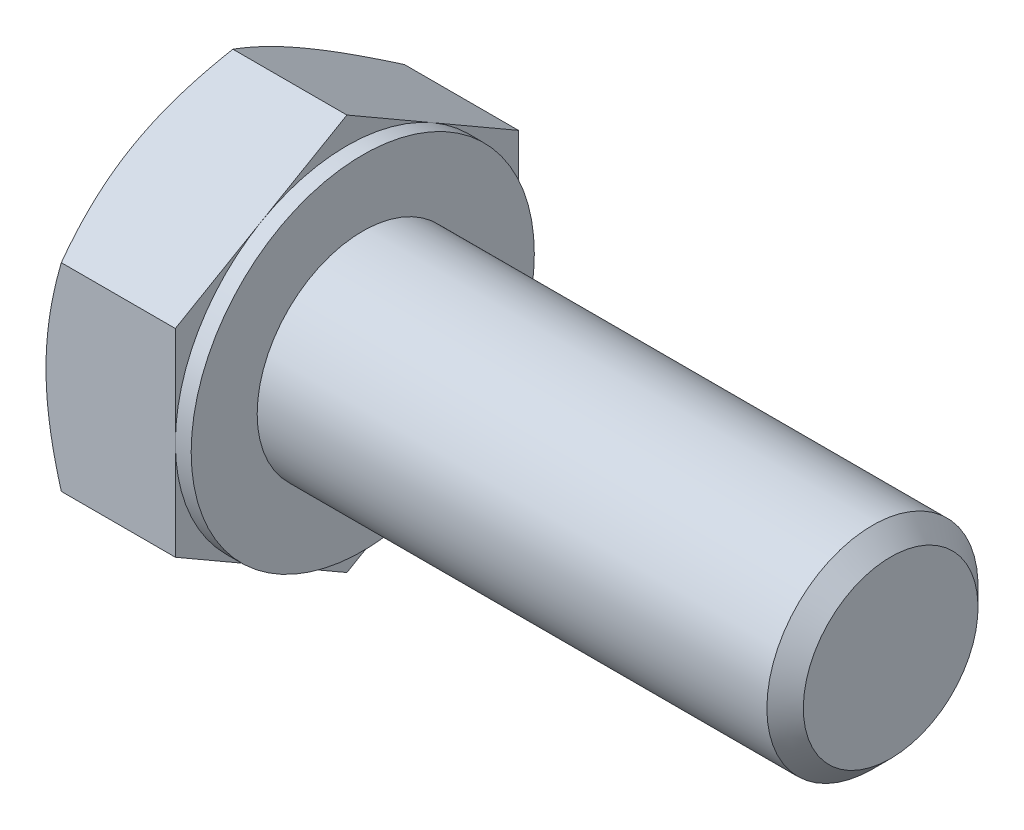
ISO-10303-21;
HEADER;
FILE_DESCRIPTION(('STEP AP214'),'2;1');
FILE_NAME('part.step','',(''),(''),'','','');
FILE_SCHEMA(('AUTOMOTIVE_DESIGN { 1 0 10303 214 1 1 1 1 }'));
ENDSEC;
DATA;
#1=APPLICATION_CONTEXT('core data for automotive mechanical design processes');
#2=APPLICATION_PROTOCOL_DEFINITION('international standard','automotive_design',2000,#1);
#3=PRODUCT_CONTEXT('',#1,'mechanical');
#4=PRODUCT('Part','Part','',(#3));
#5=PRODUCT_RELATED_PRODUCT_CATEGORY('part','',(#4));
#6=PRODUCT_DEFINITION_FORMATION('','',#4);
#7=PRODUCT_DEFINITION_CONTEXT('part definition',#1,'design');
#8=PRODUCT_DEFINITION('design','',#6,#7);
#9=PRODUCT_DEFINITION_SHAPE('','',#8);
#10=(LENGTH_UNIT() NAMED_UNIT(*) SI_UNIT(.MILLI.,.METRE.));
#11=(NAMED_UNIT(*) PLANE_ANGLE_UNIT() SI_UNIT($,.RADIAN.));
#12=(NAMED_UNIT(*) SI_UNIT($,.STERADIAN.) SOLID_ANGLE_UNIT());
#13=UNCERTAINTY_MEASURE_WITH_UNIT(LENGTH_MEASURE(1.E-05),#10,'distance_accuracy_value','');
#14=(GEOMETRIC_REPRESENTATION_CONTEXT(3) GLOBAL_UNCERTAINTY_ASSIGNED_CONTEXT((#13)) GLOBAL_UNIT_ASSIGNED_CONTEXT((#10,
#11,#12)) REPRESENTATION_CONTEXT('',''));
#15=CARTESIAN_POINT('',(0.,0.,0.));
#16=DIRECTION('',(0.,0.,1.));
#17=DIRECTION('',(1.,0.,0.));
#18=AXIS2_PLACEMENT_3D('',#15,#16,#17);
#19=CARTESIAN_POINT('',(0.,7.50555349946514,0.));
#20=DIRECTION('',(1.,0.,0.));
#21=DIRECTION('',(0.,0.,-1.));
#22=AXIS2_PLACEMENT_3D('',#19,#20,#21);
#23=PLANE('',#22);
#24=CARTESIAN_POINT('',(0.,0.,0.));
#25=DIRECTION('',(1.,0.,0.));
#26=DIRECTION('',(0.,0.,-1.));
#27=AXIS2_PLACEMENT_3D('',#24,#25,#26);
#28=CIRCLE('',#27,6.49999999995998);
#29=CARTESIAN_POINT('',(1.15546531814981E-11,-5.62916512458152,-3.24999999999));
#30=VERTEX_POINT('',#29);
#31=CARTESIAN_POINT('',(1.15518155498369E-11,0.,-6.49999999997999));
#32=VERTEX_POINT('',#31);
#33=EDGE_CURVE('E85',#30,#32,#28,.T.);
#34=ORIENTED_EDGE('',*,*,#33,.F.);
#35=CARTESIAN_POINT('',(0.,0.,0.));
#36=DIRECTION('',(1.,0.,0.));
#37=DIRECTION('',(0.,0.,-1.));
#38=AXIS2_PLACEMENT_3D('',#35,#36,#37);
#39=CIRCLE('',#38,6.49999999995998);
#40=CARTESIAN_POINT('',(1.15535774221326E-11,-5.62916512458152,3.24999999999001));
#41=VERTEX_POINT('',#40);
#42=EDGE_CURVE('E20',#41,#30,#39,.T.);
#43=ORIENTED_EDGE('',*,*,#42,.F.);
#44=CARTESIAN_POINT('',(0.,0.,0.));
#45=DIRECTION('',(1.,0.,0.));
#46=DIRECTION('',(0.,0.,-1.));
#47=AXIS2_PLACEMENT_3D('',#44,#45,#46);
#48=CIRCLE('',#47,6.49999999995998);
#49=CARTESIAN_POINT('',(1.15519510751084E-11,0.,6.49999999997999));
#50=VERTEX_POINT('',#49);
#51=EDGE_CURVE('E425',#50,#41,#48,.T.);
#52=ORIENTED_EDGE('',*,*,#51,.F.);
#53=CARTESIAN_POINT('',(0.,0.,0.));
#54=DIRECTION('',(1.,0.,0.));
#55=DIRECTION('',(0.,0.,-1.));
#56=AXIS2_PLACEMENT_3D('',#53,#54,#55);
#57=CIRCLE('',#56,6.49999999995998);
#58=CARTESIAN_POINT('',(1.1552080213042E-11,5.62916512458152,3.24999999999));
#59=VERTEX_POINT('',#58);
#60=EDGE_CURVE('E143',#59,#50,#57,.T.);
#61=ORIENTED_EDGE('',*,*,#60,.F.);
#62=CARTESIAN_POINT('',(0.,0.,0.));
#63=DIRECTION('',(1.,0.,0.));
#64=DIRECTION('',(0.,0.,-1.));
#65=AXIS2_PLACEMENT_3D('',#62,#63,#64);
#66=CIRCLE('',#65,6.49999999995998);
#67=CARTESIAN_POINT('',(1.15517781399171E-11,5.62916512458152,-3.24999999999));
#68=VERTEX_POINT('',#67);
#69=EDGE_CURVE('E426',#68,#59,#66,.T.);
#70=ORIENTED_EDGE('',*,*,#69,.F.);
#71=CARTESIAN_POINT('',(0.,0.,0.));
#72=DIRECTION('',(1.,0.,0.));
#73=DIRECTION('',(0.,0.,-1.));
#74=AXIS2_PLACEMENT_3D('',#71,#72,#73);
#75=CIRCLE('',#74,6.49999999995998);
#76=EDGE_CURVE('E88',#32,#68,#75,.T.);
#77=ORIENTED_EDGE('',*,*,#76,.F.);
#78=EDGE_LOOP('',(#34,#43,#52,#61,#70,#77));
#79=FACE_BOUND('',#78,.T.);
#80=ADVANCED_FACE('F17',(#79),#23,.F.);
#81=CARTESIAN_POINT('',(0.584039923069213,0.,0.));
#82=DIRECTION('',(1.,0.,0.));
#83=DIRECTION('',(0.,0.,-1.));
#84=AXIS2_PLACEMENT_3D('',#81,#82,#83);
#85=CONICAL_SURFACE('',#84,7.51158682032838,1.04719755118114);
#86=ORIENTED_EDGE('',*,*,#42,.T.);
#87=CARTESIAN_POINT('',(2.38325579768452E-11,-5.62916512459777,-3.24999999999938));
#88=CARTESIAN_POINT('',(-2.65652344197939E-05,-5.70880728473444,-3.11205573221975));
#89=CARTESIAN_POINT('',(0.0033797276327546,-5.78844560823781,-2.97411810968296));
#90=CARTESIAN_POINT('',(0.016860583058583,-5.94756588426545,-2.69851370708918));
#91=CARTESIAN_POINT('',(0.0269338255103951,-6.0270478646226,-2.56084687882423));
#92=CARTESIAN_POINT('',(0.0534848017047234,-6.18534206384329,-2.28667328323044));
#93=CARTESIAN_POINT('',(0.0699302938058354,-6.26415564509039,-2.15016415618406));
#94=CARTESIAN_POINT('',(0.108872020471756,-6.42140731241903,-1.87779627879596));
#95=CARTESIAN_POINT('',(0.131368414300897,-6.49984538856168,-1.74193754566893));
#96=CARTESIAN_POINT('',(0.207238975570002,-6.73427122699104,-1.33590008290232));
#97=CARTESIAN_POINT('',(0.269031363404723,-6.88957797343333,-1.06690090730607));
#98=CARTESIAN_POINT('',(0.41154041463193,-7.19885589649827,-0.531215830898221));
#99=CARTESIAN_POINT('',(0.492351589124999,-7.35281628522807,-0.264548615265171));
#100=CARTESIAN_POINT('',(0.580556583641226,-7.50555349945931,-1.01125705032068E-11));
#101=B_SPLINE_CURVE_WITH_KNOTS('',3,(#87,#88,#89,#90,#91,#92,#93,#94,#95,#96,#97,#98,#99,#100),
.UNSPECIFIED.,.F.,.F.,(4,2,2,2,2,2,4),(0.,0.4778041950496,0.95551380951934,1.43083727329502,
1.90617324917007,2.85559935539958,3.80984701130552),.UNSPECIFIED.);
#102=CARTESIAN_POINT('',(0.580556583641226,-7.50555349945931,0.));
#103=VERTEX_POINT('',#102);
#104=EDGE_CURVE('E100',#30,#103,#101,.T.);
#105=ORIENTED_EDGE('',*,*,#104,.T.);
#106=CARTESIAN_POINT('',(0.580556583641226,-7.50555349945931,1.01147123436235E-11));
#107=CARTESIAN_POINT('',(0.492351589125005,-7.35281628522806,0.264548615265161));
#108=CARTESIAN_POINT('',(0.411540414631936,-7.19885589649828,0.531215830898202));
#109=CARTESIAN_POINT('',(0.269031363404727,-6.88957797343335,1.06690090730604));
#110=CARTESIAN_POINT('',(0.207238975570004,-6.73427122699106,1.33590008290229));
#111=CARTESIAN_POINT('',(0.131368414300904,-6.49984538856169,1.74193754566889));
#112=CARTESIAN_POINT('',(0.108872020471767,-6.42140731241905,1.87779627879591));
#113=CARTESIAN_POINT('',(0.0699302938058367,-6.26415564509043,2.150164156184));
#114=CARTESIAN_POINT('',(0.0534848017047109,-6.18534206384335,2.28667328323039));
#115=CARTESIAN_POINT('',(0.0269338255104189,-6.02704786462262,2.56084687882413));
#116=CARTESIAN_POINT('',(0.0168605830586569,-5.9475658842654,2.69851370708902));
#117=CARTESIAN_POINT('',(0.00337972763268682,-5.78844560823798,2.9741181096829));
#118=CARTESIAN_POINT('',(-2.65652346796055E-05,-5.7088072847349,3.11205573221983));
#119=CARTESIAN_POINT('',(2.31066127431789E-11,-5.62916512459895,3.24999999999984));
#120=B_SPLINE_CURVE_WITH_KNOTS('',3,(#106,#107,#108,#109,#110,#111,#112,#113,#114,#115,#116,
#117,#118,#119),.UNSPECIFIED.,.F.,.F.,(4,2,2,2,2,2,4),(0.,0.954247655905908,1.90367376213542,
2.37900973801043,2.85433320178609,3.33204281625579,3.80984701130534),.UNSPECIFIED.);
#121=EDGE_CURVE('E106',#103,#41,#120,.T.);
#122=ORIENTED_EDGE('',*,*,#121,.T.);
#123=EDGE_LOOP('',(#86,#105,#122));
#124=FACE_BOUND('',#123,.T.);
#125=ADVANCED_FACE('F104',(#124),#85,.T.);
#126=CARTESIAN_POINT('',(0.584039923069213,0.,0.));
#127=DIRECTION('',(1.,0.,0.));
#128=DIRECTION('',(0.,0.,-1.));
#129=AXIS2_PLACEMENT_3D('',#126,#127,#128);
#130=CONICAL_SURFACE('',#129,7.51158682032838,1.04719755118114);
#131=ORIENTED_EDGE('',*,*,#33,.T.);
#132=CARTESIAN_POINT('',(2.38257762244022E-11,0.,-6.49999999999875));
#133=CARTESIAN_POINT('',(-2.65652344264496E-05,-0.159284320271938,-6.49999999999955));
#134=CARTESIAN_POINT('',(0.00337972763274824,-0.318560967278108,-6.49999999999988));
#135=CARTESIAN_POINT('',(0.0168605830585772,-0.636801519332982,-6.50000000000012));
#136=CARTESIAN_POINT('',(0.0269338255103896,-0.79576548004743,-6.50000000000003));
#137=CARTESIAN_POINT('',(0.053484801704718,-1.11235387848891,-6.49999999999997));
#138=CARTESIAN_POINT('',(0.0699302938058299,-1.26998104098307,-6.49999999999999));
#139=CARTESIAN_POINT('',(0.10887202047175,-1.58448437564033,-6.50000000000001));
#140=CARTESIAN_POINT('',(0.131368414300891,-1.74136052792563,-6.5));
#141=CARTESIAN_POINT('',(0.207238975569996,-2.21021220478437,-6.49999999999999));
#142=CARTESIAN_POINT('',(0.269031363404717,-2.52082569766895,-6.5));
#143=CARTESIAN_POINT('',(0.411540414631923,-3.13938154379882,-6.5));
#144=CARTESIAN_POINT('',(0.492351589124993,-3.4473023212584,-6.50000000000001));
#145=CARTESIAN_POINT('',(0.58055658364122,-3.7527767497209,-6.5));
#146=B_SPLINE_CURVE_WITH_KNOTS('',3,(#132,#133,#134,#135,#136,#137,#138,#139,#140,#141,#142,
#143,#144,#145),.UNSPECIFIED.,.F.,.F.,(4,2,2,2,2,2,4),(0.,0.477804195049599,0.955513809519338,
1.43083727329502,1.90617324917006,2.85559935539958,3.80984701130552),.UNSPECIFIED.);
#147=CARTESIAN_POINT('',(0.58055658364122,-3.75277674972966,-6.49999999999494));
#148=VERTEX_POINT('',#147);
#149=EDGE_CURVE('E95',#32,#148,#146,.T.);
#150=ORIENTED_EDGE('',*,*,#149,.T.);
#151=CARTESIAN_POINT('',(0.58055658364122,-3.75277674973842,-6.49999999998988));
#152=CARTESIAN_POINT('',(0.492351589125,-3.90551396396966,-6.23545138473484));
#153=CARTESIAN_POINT('',(0.411540414631933,-4.05947435269944,-5.9687841691018));
#154=CARTESIAN_POINT('',(0.269031363404726,-4.36875227576437,-5.43309909269397));
#155=CARTESIAN_POINT('',(0.207238975570003,-4.52405902220665,-5.16409991709772));
#156=CARTESIAN_POINT('',(0.131368414300906,-4.75848486063602,-4.75806245433112));
#157=CARTESIAN_POINT('',(0.108872020471769,-4.83692293677866,-4.62220372120411));
#158=CARTESIAN_POINT('',(0.0699302938058388,-4.99417460410728,-4.34983584381602));
#159=CARTESIAN_POINT('',(0.053484801704713,-5.07298818535436,-4.21332671676963));
#160=CARTESIAN_POINT('',(0.0269338255104213,-5.23128238457509,-3.93915312117589));
#161=CARTESIAN_POINT('',(0.0168605830586596,-5.31076436493231,-3.801486292911));
#162=CARTESIAN_POINT('',(0.00337972763269,-5.46988464095972,-3.52588189031713));
#163=CARTESIAN_POINT('',(-2.65652346763305E-05,-5.5495229644628,-3.3879442677802));
#164=CARTESIAN_POINT('',(2.31095567487627E-11,-5.62916512459875,-3.25000000000019));
#165=B_SPLINE_CURVE_WITH_KNOTS('',3,(#151,#152,#153,#154,#155,#156,#157,#158,#159,#160,#161,
#162,#163,#164),.UNSPECIFIED.,.F.,.F.,(4,2,2,2,2,2,4),(0.,0.9542476559059,1.9036737621354,
2.37900973801041,2.85433320178607,3.33204281625576,3.8098470113053),.UNSPECIFIED.);
#166=EDGE_CURVE('E93',#148,#30,#165,.T.);
#167=ORIENTED_EDGE('',*,*,#166,.T.);
#168=EDGE_LOOP('',(#131,#150,#167));
#169=FACE_BOUND('',#168,.T.);
#170=ADVANCED_FACE('F94',(#169),#130,.T.);
#171=CARTESIAN_POINT('',(0.584039923069213,0.,0.));
#172=DIRECTION('',(1.,0.,0.));
#173=DIRECTION('',(0.,0.,-1.));
#174=AXIS2_PLACEMENT_3D('',#171,#172,#173);
#175=CONICAL_SURFACE('',#174,7.51158682032838,1.04719755118114);
#176=CARTESIAN_POINT('',(0.580556583641216,3.75277674972088,-6.5));
#177=CARTESIAN_POINT('',(0.492351589124997,3.4473023212584,-6.5));
#178=CARTESIAN_POINT('',(0.411540414631929,3.13938154379883,-6.5));
#179=CARTESIAN_POINT('',(0.26903136340472,2.52082569766897,-6.5));
#180=CARTESIAN_POINT('',(0.207238975569997,2.21021220478441,-6.5));
#181=CARTESIAN_POINT('',(0.131368414300899,1.74136052792568,-6.5));
#182=CARTESIAN_POINT('',(0.108872020471763,1.58448437564038,-6.5));
#183=CARTESIAN_POINT('',(0.0699302938058331,1.26998104098315,-6.5));
#184=CARTESIAN_POINT('',(0.053484801704707,1.112353878489,-6.5));
#185=CARTESIAN_POINT('',(0.0269338255104151,0.795765480047534,-6.5));
#186=CARTESIAN_POINT('',(0.0168605830586536,0.636801519333099,-6.5));
#187=CARTESIAN_POINT('',(0.00337972763268423,0.318560967278262,-6.5));
#188=CARTESIAN_POINT('',(-2.65652346820322E-05,0.159284320272115,-6.5));
#189=CARTESIAN_POINT('',(2.31036310996737E-11,2.06995547822371E-13,-6.5));
#190=B_SPLINE_CURVE_WITH_KNOTS('',3,(#176,#177,#178,#179,#180,#181,#182,#183,#184,#185,#186,
#187,#188,#189),.UNSPECIFIED.,.F.,.F.,(4,2,2,2,2,2,4),(0.,0.954247655905902,1.9036737621354,
2.37900973801042,2.85433320178607,3.33204281625577,3.80984701130531),.UNSPECIFIED.);
#191=CARTESIAN_POINT('',(0.580556583641216,3.75277674972964,-6.49999999999494));
#192=VERTEX_POINT('',#191);
#193=EDGE_CURVE('E114',#192,#32,#190,.T.);
#194=ORIENTED_EDGE('',*,*,#193,.T.);
#195=ORIENTED_EDGE('',*,*,#76,.T.);
#196=CARTESIAN_POINT('',(2.38253841741424E-11,5.62916512459776,-3.24999999999938));
#197=CARTESIAN_POINT('',(-2.65652344257806E-05,5.54952296446249,-3.38794426777982));
#198=CARTESIAN_POINT('',(0.00337972763274904,5.46988464095969,-3.52588189031693));
#199=CARTESIAN_POINT('',(0.0168605830585776,5.31076436493246,-3.80148629291095));
#200=CARTESIAN_POINT('',(0.0269338255103895,5.23128238457516,-3.93915312117581));
#201=CARTESIAN_POINT('',(0.0534848017047175,5.07298818535436,-4.21332671676953));
#202=CARTESIAN_POINT('',(0.0699302938058295,4.9941746041073,-4.34983584381594));
#203=CARTESIAN_POINT('',(0.108872020471749,4.83692293677869,-4.62220372120405));
#204=CARTESIAN_POINT('',(0.13136841430089,4.75848486063604,-4.75806245433108));
#205=CARTESIAN_POINT('',(0.207238975569994,4.52405902220666,-5.16409991709768));
#206=CARTESIAN_POINT('',(0.269031363404715,4.36875227576437,-5.43309909269393));
#207=CARTESIAN_POINT('',(0.411540414631921,4.05947435269944,-5.96878416910178));
#208=CARTESIAN_POINT('',(0.492351589124989,3.90551396396965,-6.23545138473483));
#209=CARTESIAN_POINT('',(0.580556583641216,3.7527767497384,-6.49999999998989));
#210=B_SPLINE_CURVE_WITH_KNOTS('',3,(#196,#197,#198,#199,#200,#201,#202,#203,#204,#205,#206,
#207,#208,#209),.UNSPECIFIED.,.F.,.F.,(4,2,2,2,2,2,4),(0.,0.477804195049598,0.955513809519334,
1.43083727329501,1.90617324917006,2.85559935539956,3.8098470113055),.UNSPECIFIED.);
#211=EDGE_CURVE('E219',#68,#192,#210,.T.);
#212=ORIENTED_EDGE('',*,*,#211,.T.);
#213=EDGE_LOOP('',(#194,#195,#212));
#214=FACE_BOUND('',#213,.T.);
#215=ADVANCED_FACE('F209',(#214),#175,.T.);
#216=CARTESIAN_POINT('',(0.584039923069213,0.,0.));
#217=DIRECTION('',(1.,0.,0.));
#218=DIRECTION('',(0.,0.,-1.));
#219=AXIS2_PLACEMENT_3D('',#216,#217,#218);
#220=CONICAL_SURFACE('',#219,7.51158682032838,1.04719755118114);
#221=CARTESIAN_POINT('',(0.580556583641221,7.5055534994593,-1.01144862034732E-11));
#222=CARTESIAN_POINT('',(0.492351589125001,7.35281628522806,-0.26454861526516));
#223=CARTESIAN_POINT('',(0.411540414631932,7.19885589649827,-0.531215830898201));
#224=CARTESIAN_POINT('',(0.269031363404723,6.88957797343334,-1.06690090730603));
#225=CARTESIAN_POINT('',(0.20723897557,6.73427122699106,-1.33590008290229));
#226=CARTESIAN_POINT('',(0.131368414300901,6.49984538856169,-1.74193754566888));
#227=CARTESIAN_POINT('',(0.108872020471764,6.42140731241904,-1.8777962787959));
#228=CARTESIAN_POINT('',(0.0699302938058345,6.26415564509043,-2.15016415618399));
#229=CARTESIAN_POINT('',(0.0534848017047085,6.18534206384335,-2.28667328323038));
#230=CARTESIAN_POINT('',(0.0269338255104163,6.02704786462262,-2.56084687882412));
#231=CARTESIAN_POINT('',(0.0168605830586543,5.9475658842654,-2.69851370708901));
#232=CARTESIAN_POINT('',(0.00337972763268413,5.78844560823798,-2.97411810968289));
#233=CARTESIAN_POINT('',(-2.65652346823943E-05,5.70880728473491,-3.11205573221982));
#234=CARTESIAN_POINT('',(2.31035562798342E-11,5.62916512459895,-3.24999999999983));
#235=B_SPLINE_CURVE_WITH_KNOTS('',3,(#221,#222,#223,#224,#225,#226,#227,#228,#229,#230,#231,
#232,#233,#234),.UNSPECIFIED.,.F.,.F.,(4,2,2,2,2,2,4),(0.,0.954247655905905,1.90367376213541,
2.37900973801043,2.85433320178608,3.33204281625578,3.80984701130532),.UNSPECIFIED.);
#236=CARTESIAN_POINT('',(0.580556583641221,7.5055534994593,0.));
#237=VERTEX_POINT('',#236);
#238=EDGE_CURVE('E214',#237,#68,#235,.T.);
#239=ORIENTED_EDGE('',*,*,#238,.T.);
#240=ORIENTED_EDGE('',*,*,#69,.T.);
#241=CARTESIAN_POINT('',(2.38257500923756E-11,5.62916512459776,3.24999999999938));
#242=CARTESIAN_POINT('',(-2.65652344257552E-05,5.70880728473443,3.11205573221975));
#243=CARTESIAN_POINT('',(0.00337972763274897,5.7884456082378,2.97411810968296));
#244=CARTESIAN_POINT('',(0.0168605830585776,5.94756588426544,2.69851370708918));
#245=CARTESIAN_POINT('',(0.0269338255103896,6.02704786462259,2.56084687882423));
#246=CARTESIAN_POINT('',(0.0534848017047181,6.18534206384328,2.28667328323044));
#247=CARTESIAN_POINT('',(0.0699302938058302,6.26415564509038,2.15016415618406));
#248=CARTESIAN_POINT('',(0.10887202047175,6.42140731241902,1.87779627879596));
#249=CARTESIAN_POINT('',(0.131368414300891,6.49984538856167,1.74193754566893));
#250=CARTESIAN_POINT('',(0.207238975569995,6.73427122699103,1.33590008290232));
#251=CARTESIAN_POINT('',(0.269031363404717,6.88957797343332,1.06690090730607));
#252=CARTESIAN_POINT('',(0.411540414631924,7.19885589649826,0.531215830898222));
#253=CARTESIAN_POINT('',(0.492351589124994,7.35281628522806,0.264548615265173));
#254=CARTESIAN_POINT('',(0.580556583641221,7.5055534994593,1.01137987216797E-11));
#255=B_SPLINE_CURVE_WITH_KNOTS('',3,(#241,#242,#243,#244,#245,#246,#247,#248,#249,#250,#251,
#252,#253,#254),.UNSPECIFIED.,.F.,.F.,(4,2,2,2,2,2,4),(0.,0.4778041950496,0.955513809519338,
1.43083727329502,1.90617324917006,2.85559935539958,3.80984701130552),.UNSPECIFIED.);
#256=EDGE_CURVE('E201',#59,#237,#255,.T.);
#257=ORIENTED_EDGE('',*,*,#256,.T.);
#258=EDGE_LOOP('',(#239,#240,#257));
#259=FACE_BOUND('',#258,.T.);
#260=ADVANCED_FACE('F206',(#259),#220,.T.);
#261=CARTESIAN_POINT('',(0.584039923069213,0.,0.));
#262=DIRECTION('',(1.,0.,0.));
#263=DIRECTION('',(0.,0.,-1.));
#264=AXIS2_PLACEMENT_3D('',#261,#262,#263);
#265=CONICAL_SURFACE('',#264,7.51158682032838,1.04719755118114);
#266=ORIENTED_EDGE('',*,*,#51,.T.);
#267=CARTESIAN_POINT('',(2.38300876645125E-11,-5.62916512459776,3.24999999999939));
#268=CARTESIAN_POINT('',(-2.65652344226972E-05,-5.54952296446249,3.38794426777983));
#269=CARTESIAN_POINT('',(0.00337972763275166,-5.46988464095969,3.52588189031694));
#270=CARTESIAN_POINT('',(0.0168605830585802,-5.31076436493246,3.80148629291096));
#271=CARTESIAN_POINT('',(0.0269338255103924,-5.23128238457516,3.93915312117582));
#272=CARTESIAN_POINT('',(0.0534848017047206,-5.07298818535436,4.21332671676954));
#273=CARTESIAN_POINT('',(0.0699302938058323,-4.9941746041073,4.34983584381595));
#274=CARTESIAN_POINT('',(0.108872020471752,-4.83692293677869,4.62220372120406));
#275=CARTESIAN_POINT('',(0.131368414300893,-4.75848486063604,4.75806245433109));
#276=CARTESIAN_POINT('',(0.207238975569996,-4.52405902220666,5.16409991709768));
#277=CARTESIAN_POINT('',(0.269031363404717,-4.36875227576437,5.43309909269394));
#278=CARTESIAN_POINT('',(0.411540414631922,-4.05947435269944,5.96878416910179));
#279=CARTESIAN_POINT('',(0.492351589124991,-3.90551396396965,6.23545138473484));
#280=CARTESIAN_POINT('',(0.580556583641217,-3.7527767497384,6.49999999998989));
#281=B_SPLINE_CURVE_WITH_KNOTS('',3,(#267,#268,#269,#270,#271,#272,#273,#274,#275,#276,#277,
#278,#279,#280),.UNSPECIFIED.,.F.,.F.,(4,2,2,2,2,2,4),(0.,0.477804195049597,0.955513809519332,
1.43083727329501,1.90617324917005,2.85559935539956,3.80984701130549),.UNSPECIFIED.);
#282=CARTESIAN_POINT('',(0.580556583642902,-3.75277674973548,6.49999999999494));
#283=VERTEX_POINT('',#282);
#284=EDGE_CURVE('E101',#41,#283,#281,.T.);
#285=ORIENTED_EDGE('',*,*,#284,.T.);
#286=CARTESIAN_POINT('',(0.580556583641216,-3.75277674972088,6.5));
#287=CARTESIAN_POINT('',(0.492351589124997,-3.4473023212584,6.5));
#288=CARTESIAN_POINT('',(0.411540414631929,-3.13938154379883,6.5));
#289=CARTESIAN_POINT('',(0.269031363404721,-2.52082569766897,6.5));
#290=CARTESIAN_POINT('',(0.207238975569998,-2.21021220478441,6.5));
#291=CARTESIAN_POINT('',(0.1313684143009,-1.74136052792568,6.5));
#292=CARTESIAN_POINT('',(0.108872020471763,-1.58448437564038,6.5));
#293=CARTESIAN_POINT('',(0.0699302938058334,-1.26998104098315,6.5));
#294=CARTESIAN_POINT('',(0.0534848017047079,-1.112353878489,6.5));
#295=CARTESIAN_POINT('',(0.026933825510416,-0.795765480047534,6.5));
#296=CARTESIAN_POINT('',(0.0168605830586538,-0.636801519333099,6.5));
#297=CARTESIAN_POINT('',(0.00337972763268369,-0.318560967278262,6.5));
#298=CARTESIAN_POINT('',(-2.65652346827006E-05,-0.159284320272115,6.5));
#299=CARTESIAN_POINT('',(2.31039021502168E-11,-2.0623652689199E-13,6.5));
#300=B_SPLINE_CURVE_WITH_KNOTS('',3,(#286,#287,#288,#289,#290,#291,#292,#293,#294,#295,#296,
#297,#298,#299),.UNSPECIFIED.,.F.,.F.,(4,2,2,2,2,2,4),(0.,0.954247655905902,1.9036737621354,
2.37900973801042,2.85433320178607,3.33204281625577,3.80984701130531),.UNSPECIFIED.);
#301=EDGE_CURVE('E180',#283,#50,#300,.T.);
#302=ORIENTED_EDGE('',*,*,#301,.T.);
#303=EDGE_LOOP('',(#266,#285,#302));
#304=FACE_BOUND('',#303,.T.);
#305=ADVANCED_FACE('F158',(#304),#265,.T.);
#306=CARTESIAN_POINT('',(0.584039923069213,0.,0.));
#307=DIRECTION('',(1.,0.,0.));
#308=DIRECTION('',(0.,0.,-1.));
#309=AXIS2_PLACEMENT_3D('',#306,#307,#308);
#310=CONICAL_SURFACE('',#309,7.51158682032838,1.04719755118114);
#311=CARTESIAN_POINT('',(0.580556583641216,3.7527767497384,6.49999999998989));
#312=CARTESIAN_POINT('',(0.492351589124997,3.90551396396964,6.23545138473484));
#313=CARTESIAN_POINT('',(0.411540414631929,4.05947435269943,5.9687841691018));
#314=CARTESIAN_POINT('',(0.269031363404721,4.36875227576436,5.43309909269397));
#315=CARTESIAN_POINT('',(0.207238975569998,4.52405902220664,5.16409991709772));
#316=CARTESIAN_POINT('',(0.1313684143009,4.75848486063601,4.75806245433112));
#317=CARTESIAN_POINT('',(0.108872020471763,4.83692293677865,4.6222037212041));
#318=CARTESIAN_POINT('',(0.0699302938058336,4.99417460410727,4.34983584381602));
#319=CARTESIAN_POINT('',(0.053484801704708,5.07298818535435,4.21332671676963));
#320=CARTESIAN_POINT('',(0.0269338255104162,5.23128238457508,3.93915312117589));
#321=CARTESIAN_POINT('',(0.0168605830586542,5.3107643649323,3.801486292911));
#322=CARTESIAN_POINT('',(0.0033797276326841,5.46988464095971,3.52588189031713));
#323=CARTESIAN_POINT('',(-2.65652346823871E-05,5.54952296446279,3.3879442677802));
#324=CARTESIAN_POINT('',(2.3103743517881E-11,5.62916512459874,3.25000000000019));
#325=B_SPLINE_CURVE_WITH_KNOTS('',3,(#311,#312,#313,#314,#315,#316,#317,#318,#319,#320,#321,
#322,#323,#324),.UNSPECIFIED.,.F.,.F.,(4,2,2,2,2,2,4),(0.,0.9542476559059,1.9036737621354,
2.37900973801042,2.85433320178607,3.33204281625577,3.80984701130531),.UNSPECIFIED.);
#326=CARTESIAN_POINT('',(0.580556583641216,3.75277674972964,6.49999999999494));
#327=VERTEX_POINT('',#326);
#328=EDGE_CURVE('E164',#327,#59,#325,.T.);
#329=ORIENTED_EDGE('',*,*,#328,.T.);
#330=ORIENTED_EDGE('',*,*,#60,.T.);
#331=CARTESIAN_POINT('',(2.38257917229847E-11,0.,6.49999999999875));
#332=CARTESIAN_POINT('',(-2.65652344260361E-05,0.159284320271937,6.49999999999955));
#333=CARTESIAN_POINT('',(0.00337972763274861,0.318560967278107,6.49999999999988));
#334=CARTESIAN_POINT('',(0.0168605830585772,0.63680151933298,6.50000000000012));
#335=CARTESIAN_POINT('',(0.0269338255103893,0.795765480047427,6.50000000000003));
#336=CARTESIAN_POINT('',(0.0534848017047176,1.11235387848891,6.49999999999997));
#337=CARTESIAN_POINT('',(0.0699302938058295,1.26998104098307,6.49999999999999));
#338=CARTESIAN_POINT('',(0.108872020471749,1.58448437564032,6.50000000000001));
#339=CARTESIAN_POINT('',(0.13136841430089,1.74136052792562,6.5));
#340=CARTESIAN_POINT('',(0.207238975569994,2.21021220478437,6.49999999999999));
#341=CARTESIAN_POINT('',(0.269031363404715,2.52082569766894,6.5));
#342=CARTESIAN_POINT('',(0.411540414631921,3.13938154379881,6.5));
#343=CARTESIAN_POINT('',(0.492351589124989,3.44730232125839,6.50000000000001));
#344=CARTESIAN_POINT('',(0.580556583641216,3.75277674972088,6.5));
#345=B_SPLINE_CURVE_WITH_KNOTS('',3,(#331,#332,#333,#334,#335,#336,#337,#338,#339,#340,#341,
#342,#343,#344),.UNSPECIFIED.,.F.,.F.,(4,2,2,2,2,2,4),(0.,0.477804195049598,0.955513809519334,
1.43083727329501,1.90617324917006,2.85559935539956,3.8098470113055),.UNSPECIFIED.);
#346=EDGE_CURVE('E172',#50,#327,#345,.T.);
#347=ORIENTED_EDGE('',*,*,#346,.T.);
#348=EDGE_LOOP('',(#329,#330,#347));
#349=FACE_BOUND('',#348,.T.);
#350=ADVANCED_FACE('F153',(#349),#310,.T.);
#351=CARTESIAN_POINT('',(5.5,-7.50555349946515,0.));
#352=DIRECTION('',(0.,0.866025403784438,-0.500000000000002));
#353=DIRECTION('',(0.,0.500000000000002,0.866025403784438));
#354=AXIS2_PLACEMENT_3D('',#351,#352,#353);
#355=PLANE('',#354);
#356=DIRECTION('',(1.,0.,0.));
#357=VECTOR('',#356,1.);
#358=CARTESIAN_POINT('',(5.5,-3.75277674973256,6.5));
#359=LINE('',#358,#357);
#360=CARTESIAN_POINT('',(4.9,-3.75277674973256,6.5));
#361=VERTEX_POINT('',#360);
#362=EDGE_CURVE('E339',#361,#283,#359,.F.);
#363=ORIENTED_EDGE('',*,*,#362,.T.);
#364=ORIENTED_EDGE('',*,*,#284,.F.);
#365=ORIENTED_EDGE('',*,*,#121,.F.);
#366=DIRECTION('',(1.,0.,0.));
#367=VECTOR('',#366,1.);
#368=CARTESIAN_POINT('',(5.5,-7.50555349946515,0.));
#369=LINE('',#368,#367);
#370=CARTESIAN_POINT('',(4.9,-7.50555349946515,0.));
#371=VERTEX_POINT('',#370);
#372=EDGE_CURVE('E112',#103,#371,#369,.T.);
#373=ORIENTED_EDGE('',*,*,#372,.T.);
#374=DIRECTION('',(0.,-0.500000000000003,-0.866025403784437));
#375=VECTOR('',#374,1.);
#376=CARTESIAN_POINT('',(4.9,-5.62916512459884,3.25000000000001));
#377=LINE('',#376,#375);
#378=CARTESIAN_POINT('',(4.9,-5.62916512459885,3.25000000000001));
#379=VERTEX_POINT('',#378);
#380=EDGE_CURVE('E293',#379,#371,#377,.T.);
#381=ORIENTED_EDGE('',*,*,#380,.F.);
#382=DIRECTION('',(0.,-0.500000000000001,-0.866025403784438));
#383=VECTOR('',#382,1.);
#384=CARTESIAN_POINT('',(4.9,-3.75277674973256,6.5));
#385=LINE('',#384,#383);
#386=EDGE_CURVE('E351',#361,#379,#385,.T.);
#387=ORIENTED_EDGE('',*,*,#386,.F.);
#388=EDGE_LOOP('',(#363,#364,#365,#373,#381,#387));
#389=FACE_BOUND('',#388,.T.);
#390=ADVANCED_FACE('F149',(#389),#355,.F.);
#391=CARTESIAN_POINT('',(5.5,-3.75277674973258,-6.5));
#392=DIRECTION('',(0.,0.866025403784438,0.500000000000001));
#393=DIRECTION('',(0.,-0.500000000000001,0.866025403784438));
#394=AXIS2_PLACEMENT_3D('',#391,#392,#393);
#395=PLANE('',#394);
#396=ORIENTED_EDGE('',*,*,#372,.F.);
#397=ORIENTED_EDGE('',*,*,#104,.F.);
#398=ORIENTED_EDGE('',*,*,#166,.F.);
#399=DIRECTION('',(1.,0.,0.));
#400=VECTOR('',#399,1.);
#401=CARTESIAN_POINT('',(5.5,-3.75277674973258,-6.5));
#402=LINE('',#401,#400);
#403=CARTESIAN_POINT('',(4.9,-3.75277674973258,-6.5));
#404=VERTEX_POINT('',#403);
#405=EDGE_CURVE('E220',#148,#404,#402,.T.);
#406=ORIENTED_EDGE('',*,*,#405,.T.);
#407=DIRECTION('',(0.,0.499999999999998,-0.86602540378444));
#408=VECTOR('',#407,1.);
#409=CARTESIAN_POINT('',(4.9,-5.62916512459885,-3.25));
#410=LINE('',#409,#408);
#411=CARTESIAN_POINT('',(4.9,-5.62916512459885,-3.25));
#412=VERTEX_POINT('',#411);
#413=EDGE_CURVE('E296',#412,#404,#410,.T.);
#414=ORIENTED_EDGE('',*,*,#413,.F.);
#415=DIRECTION('',(0.,0.500000000000003,-0.866025403784437));
#416=VECTOR('',#415,1.);
#417=CARTESIAN_POINT('',(4.9,-7.50555349946515,0.));
#418=LINE('',#417,#416);
#419=EDGE_CURVE('E287',#371,#412,#418,.T.);
#420=ORIENTED_EDGE('',*,*,#419,.F.);
#421=EDGE_LOOP('',(#396,#397,#398,#406,#414,#420));
#422=FACE_BOUND('',#421,.T.);
#423=ADVANCED_FACE('F109',(#422),#395,.F.);
#424=CARTESIAN_POINT('',(5.5,3.75277674973256,-6.5));
#425=DIRECTION('',(0.,0.,1.));
#426=DIRECTION('',(1.,0.,0.));
#427=AXIS2_PLACEMENT_3D('',#424,#425,#426);
#428=PLANE('',#427);
#429=ORIENTED_EDGE('',*,*,#405,.F.);
#430=ORIENTED_EDGE('',*,*,#149,.F.);
#431=ORIENTED_EDGE('',*,*,#193,.F.);
#432=DIRECTION('',(1.,0.,0.));
#433=VECTOR('',#432,1.);
#434=CARTESIAN_POINT('',(5.5,3.75277674973256,-6.5));
#435=LINE('',#434,#433);
#436=CARTESIAN_POINT('',(4.9,3.75277674973256,-6.5));
#437=VERTEX_POINT('',#436);
#438=EDGE_CURVE('E332',#192,#437,#435,.T.);
#439=ORIENTED_EDGE('',*,*,#438,.T.);
#440=DIRECTION('',(0.,1.,0.));
#441=VECTOR('',#440,1.);
#442=CARTESIAN_POINT('',(4.9,6.5,-6.5));
#443=LINE('',#442,#441);
#444=CARTESIAN_POINT('',(4.9,0.,-6.5));
#445=VERTEX_POINT('',#444);
#446=EDGE_CURVE('E372',#445,#437,#443,.T.);
#447=ORIENTED_EDGE('',*,*,#446,.F.);
#448=DIRECTION('',(0.,1.,0.));
#449=VECTOR('',#448,1.);
#450=CARTESIAN_POINT('',(4.9,6.5,-6.5));
#451=LINE('',#450,#449);
#452=EDGE_CURVE('E304',#404,#445,#451,.T.);
#453=ORIENTED_EDGE('',*,*,#452,.F.);
#454=EDGE_LOOP('',(#429,#430,#431,#439,#447,#453));
#455=FACE_BOUND('',#454,.T.);
#456=ADVANCED_FACE('F227',(#455),#428,.F.);
#457=CARTESIAN_POINT('',(5.5,3.75277674973256,-6.5));
#458=DIRECTION('',(0.,-0.866025403784438,0.500000000000001));
#459=DIRECTION('',(0.,-0.500000000000001,-0.866025403784438));
#460=AXIS2_PLACEMENT_3D('',#457,#458,#459);
#461=PLANE('',#460);
#462=ORIENTED_EDGE('',*,*,#438,.F.);
#463=ORIENTED_EDGE('',*,*,#211,.F.);
#464=ORIENTED_EDGE('',*,*,#238,.F.);
#465=DIRECTION('',(1.,0.,0.));
#466=VECTOR('',#465,1.);
#467=CARTESIAN_POINT('',(5.5,7.50555349946514,0.));
#468=LINE('',#467,#466);
#469=CARTESIAN_POINT('',(4.9,7.50555349946514,0.));
#470=VERTEX_POINT('',#469);
#471=EDGE_CURVE('E205',#237,#470,#468,.T.);
#472=ORIENTED_EDGE('',*,*,#471,.T.);
#473=DIRECTION('',(0.,0.500000000000001,0.866025403784438));
#474=VECTOR('',#473,1.);
#475=CARTESIAN_POINT('',(4.9,5.62916512459885,-3.25000000000001));
#476=LINE('',#475,#474);
#477=CARTESIAN_POINT('',(4.9,5.62916512459885,-3.25000000000001));
#478=VERTEX_POINT('',#477);
#479=EDGE_CURVE('E377',#478,#470,#476,.T.);
#480=ORIENTED_EDGE('',*,*,#479,.F.);
#481=DIRECTION('',(0.,0.500000000000002,0.866025403784438));
#482=VECTOR('',#481,1.);
#483=CARTESIAN_POINT('',(4.9,3.75277674973256,-6.5));
#484=LINE('',#483,#482);
#485=EDGE_CURVE('E367',#437,#478,#484,.T.);
#486=ORIENTED_EDGE('',*,*,#485,.F.);
#487=EDGE_LOOP('',(#462,#463,#464,#472,#480,#486));
#488=FACE_BOUND('',#487,.T.);
#489=ADVANCED_FACE('F197',(#488),#461,.F.);
#490=CARTESIAN_POINT('',(5.5,7.50555349946514,0.));
#491=DIRECTION('',(0.,-0.866025403784438,-0.500000000000001));
#492=DIRECTION('',(0.,0.500000000000001,-0.866025403784438));
#493=AXIS2_PLACEMENT_3D('',#490,#491,#492);
#494=PLANE('',#493);
#495=ORIENTED_EDGE('',*,*,#471,.F.);
#496=ORIENTED_EDGE('',*,*,#256,.F.);
#497=ORIENTED_EDGE('',*,*,#328,.F.);
#498=DIRECTION('',(1.,0.,0.));
#499=VECTOR('',#498,1.);
#500=CARTESIAN_POINT('',(5.5,3.75277674973256,6.5));
#501=LINE('',#500,#499);
#502=CARTESIAN_POINT('',(4.9,3.75277674973256,6.5));
#503=VERTEX_POINT('',#502);
#504=EDGE_CURVE('E179',#327,#503,#501,.T.);
#505=ORIENTED_EDGE('',*,*,#504,.T.);
#506=DIRECTION('',(0.,-0.500000000000001,0.866025403784438));
#507=VECTOR('',#506,1.);
#508=CARTESIAN_POINT('',(4.9,5.62916512459885,3.25000000000001));
#509=LINE('',#508,#507);
#510=CARTESIAN_POINT('',(4.9,5.62916512459885,3.25000000000001));
#511=VERTEX_POINT('',#510);
#512=EDGE_CURVE('E387',#511,#503,#509,.T.);
#513=ORIENTED_EDGE('',*,*,#512,.F.);
#514=DIRECTION('',(0.,-0.500000000000001,0.866025403784438));
#515=VECTOR('',#514,1.);
#516=CARTESIAN_POINT('',(4.9,7.50555349946514,0.));
#517=LINE('',#516,#515);
#518=EDGE_CURVE('E382',#470,#511,#517,.T.);
#519=ORIENTED_EDGE('',*,*,#518,.F.);
#520=EDGE_LOOP('',(#495,#496,#497,#505,#513,#519));
#521=FACE_BOUND('',#520,.T.);
#522=ADVANCED_FACE('F191',(#521),#494,.F.);
#523=CARTESIAN_POINT('',(5.5,3.75277674973256,6.5));
#524=DIRECTION('',(0.,0.,-1.));
#525=DIRECTION('',(0.,1.,0.));
#526=AXIS2_PLACEMENT_3D('',#523,#524,#525);
#527=PLANE('',#526);
#528=ORIENTED_EDGE('',*,*,#504,.F.);
#529=ORIENTED_EDGE('',*,*,#346,.F.);
#530=ORIENTED_EDGE('',*,*,#301,.F.);
#531=ORIENTED_EDGE('',*,*,#362,.F.);
#532=DIRECTION('',(0.,1.,0.));
#533=VECTOR('',#532,1.);
#534=CARTESIAN_POINT('',(4.9,6.5,6.5));
#535=LINE('',#534,#533);
#536=CARTESIAN_POINT('',(4.9,0.,6.5));
#537=VERTEX_POINT('',#536);
#538=EDGE_CURVE('E35',#537,#361,#535,.F.);
#539=ORIENTED_EDGE('',*,*,#538,.F.);
#540=DIRECTION('',(0.,1.,0.));
#541=VECTOR('',#540,1.);
#542=CARTESIAN_POINT('',(4.9,6.5,6.5));
#543=LINE('',#542,#541);
#544=EDGE_CURVE('E311',#503,#537,#543,.F.);
#545=ORIENTED_EDGE('',*,*,#544,.F.);
#546=EDGE_LOOP('',(#528,#529,#530,#531,#539,#545));
#547=FACE_BOUND('',#546,.T.);
#548=ADVANCED_FACE('F186',(#547),#527,.F.);
#549=CARTESIAN_POINT('',(4.9,6.5,0.));
#550=DIRECTION('',(1.,0.,0.));
#551=DIRECTION('',(0.,0.,-1.));
#552=AXIS2_PLACEMENT_3D('',#549,#550,#551);
#553=PLANE('',#552);
#554=ORIENTED_EDGE('',*,*,#386,.T.);
#555=CARTESIAN_POINT('',(4.9,0.,0.));
#556=DIRECTION('',(-1.,0.,0.));
#557=DIRECTION('',(0.,0.,1.));
#558=AXIS2_PLACEMENT_3D('',#555,#556,#557);
#559=CIRCLE('',#558,6.5);
#560=EDGE_CURVE('E181',#537,#379,#559,.F.);
#561=ORIENTED_EDGE('',*,*,#560,.F.);
#562=ORIENTED_EDGE('',*,*,#538,.T.);
#563=EDGE_LOOP('',(#554,#561,#562));
#564=FACE_BOUND('',#563,.T.);
#565=ADVANCED_FACE('F190',(#564),#553,.T.);
#566=CARTESIAN_POINT('',(4.9,6.5,0.));
#567=DIRECTION('',(1.,0.,0.));
#568=DIRECTION('',(0.,0.,-1.));
#569=AXIS2_PLACEMENT_3D('',#566,#567,#568);
#570=PLANE('',#569);
#571=ORIENTED_EDGE('',*,*,#419,.T.);
#572=CARTESIAN_POINT('',(4.9,0.,0.));
#573=DIRECTION('',(-1.,0.,0.));
#574=DIRECTION('',(0.,0.,1.));
#575=AXIS2_PLACEMENT_3D('',#572,#573,#574);
#576=CIRCLE('',#575,6.5);
#577=EDGE_CURVE('E290',#379,#412,#576,.F.);
#578=ORIENTED_EDGE('',*,*,#577,.F.);
#579=ORIENTED_EDGE('',*,*,#380,.T.);
#580=EDGE_LOOP('',(#571,#578,#579));
#581=FACE_BOUND('',#580,.T.);
#582=ADVANCED_FACE('F276',(#581),#570,.T.);
#583=CARTESIAN_POINT('',(4.9,6.5,0.));
#584=DIRECTION('',(1.,0.,0.));
#585=DIRECTION('',(0.,0.,-1.));
#586=AXIS2_PLACEMENT_3D('',#583,#584,#585);
#587=PLANE('',#586);
#588=ORIENTED_EDGE('',*,*,#452,.T.);
#589=CARTESIAN_POINT('',(4.9,0.,0.));
#590=DIRECTION('',(-1.,0.,0.));
#591=DIRECTION('',(0.,0.,1.));
#592=AXIS2_PLACEMENT_3D('',#589,#590,#591);
#593=CIRCLE('',#592,6.5);
#594=EDGE_CURVE('E301',#412,#445,#593,.F.);
#595=ORIENTED_EDGE('',*,*,#594,.F.);
#596=ORIENTED_EDGE('',*,*,#413,.T.);
#597=EDGE_LOOP('',(#588,#595,#596));
#598=FACE_BOUND('',#597,.T.);
#599=ADVANCED_FACE('F273',(#598),#587,.T.);
#600=CARTESIAN_POINT('',(4.9,6.5,0.));
#601=DIRECTION('',(1.,0.,0.));
#602=DIRECTION('',(0.,0.,-1.));
#603=AXIS2_PLACEMENT_3D('',#600,#601,#602);
#604=PLANE('',#603);
#605=CARTESIAN_POINT('',(4.9,0.,0.));
#606=DIRECTION('',(-1.,0.,0.));
#607=DIRECTION('',(0.,0.,1.));
#608=AXIS2_PLACEMENT_3D('',#605,#606,#607);
#609=CIRCLE('',#608,6.5);
#610=EDGE_CURVE('E307',#445,#478,#609,.F.);
#611=ORIENTED_EDGE('',*,*,#610,.F.);
#612=ORIENTED_EDGE('',*,*,#446,.T.);
#613=ORIENTED_EDGE('',*,*,#485,.T.);
#614=EDGE_LOOP('',(#611,#612,#613));
#615=FACE_BOUND('',#614,.T.);
#616=ADVANCED_FACE('F269',(#615),#604,.T.);
#617=CARTESIAN_POINT('',(4.9,6.5,0.));
#618=DIRECTION('',(1.,0.,0.));
#619=DIRECTION('',(0.,0.,-1.));
#620=AXIS2_PLACEMENT_3D('',#617,#618,#619);
#621=PLANE('',#620);
#622=ORIENTED_EDGE('',*,*,#518,.T.);
#623=CARTESIAN_POINT('',(4.9,0.,0.));
#624=DIRECTION('',(-1.,0.,0.));
#625=DIRECTION('',(0.,0.,1.));
#626=AXIS2_PLACEMENT_3D('',#623,#624,#625);
#627=CIRCLE('',#626,6.5);
#628=EDGE_CURVE('E314',#478,#511,#627,.F.);
#629=ORIENTED_EDGE('',*,*,#628,.F.);
#630=ORIENTED_EDGE('',*,*,#479,.T.);
#631=EDGE_LOOP('',(#622,#629,#630));
#632=FACE_BOUND('',#631,.T.);
#633=ADVANCED_FACE('F265',(#632),#621,.T.);
#634=CARTESIAN_POINT('',(4.9,6.5,0.));
#635=DIRECTION('',(1.,0.,0.));
#636=DIRECTION('',(0.,0.,-1.));
#637=AXIS2_PLACEMENT_3D('',#634,#635,#636);
#638=PLANE('',#637);
#639=ORIENTED_EDGE('',*,*,#544,.T.);
#640=CARTESIAN_POINT('',(4.9,0.,0.));
#641=DIRECTION('',(-1.,0.,0.));
#642=DIRECTION('',(0.,0.,1.));
#643=AXIS2_PLACEMENT_3D('',#640,#641,#642);
#644=CIRCLE('',#643,6.5);
#645=EDGE_CURVE('E317',#511,#537,#644,.F.);
#646=ORIENTED_EDGE('',*,*,#645,.F.);
#647=ORIENTED_EDGE('',*,*,#512,.T.);
#648=EDGE_LOOP('',(#639,#646,#647));
#649=FACE_BOUND('',#648,.T.);
#650=ADVANCED_FACE('F261',(#649),#638,.T.);
#651=CARTESIAN_POINT('',(25.5,0.,0.));
#652=DIRECTION('',(-1.,0.,0.));
#653=DIRECTION('',(0.,0.,1.));
#654=AXIS2_PLACEMENT_3D('',#651,#652,#653);
#655=PLANE('',#654);
#656=CARTESIAN_POINT('',(25.5000000000223,0.,0.));
#657=DIRECTION('',(-1.,0.,0.));
#658=DIRECTION('',(0.,-1.,0.));
#659=AXIS2_PLACEMENT_3D('',#656,#657,#658);
#660=CIRCLE('',#659,3.30949999994345);
#661=CARTESIAN_POINT('',(25.5000000000223,-3.30949999994345,0.));
#662=VERTEX_POINT('',#661);
#663=EDGE_CURVE('E319',#662,#662,#660,.T.);
#664=ORIENTED_EDGE('',*,*,#663,.F.);
#665=EDGE_LOOP('',(#664));
#666=FACE_BOUND('',#665,.T.);
#667=ADVANCED_FACE('F257',(#666),#655,.F.);
#668=CARTESIAN_POINT('',(0.,0.,0.));
#669=DIRECTION('',(-1.,0.,0.));
#670=DIRECTION('',(0.,0.,1.));
#671=AXIS2_PLACEMENT_3D('',#668,#669,#670);
#672=CYLINDRICAL_SURFACE('',#671,6.5);
#673=ORIENTED_EDGE('',*,*,#594,.T.);
#674=ORIENTED_EDGE('',*,*,#610,.T.);
#675=ORIENTED_EDGE('',*,*,#628,.T.);
#676=ORIENTED_EDGE('',*,*,#645,.T.);
#677=ORIENTED_EDGE('',*,*,#560,.T.);
#678=ORIENTED_EDGE('',*,*,#577,.T.);
#679=EDGE_LOOP('',(#673,#674,#675,#676,#677,#678));
#680=FACE_BOUND('',#679,.T.);
#681=CARTESIAN_POINT('',(5.5,0.,0.));
#682=DIRECTION('',(-1.,0.,0.));
#683=DIRECTION('',(0.,0.,1.));
#684=AXIS2_PLACEMENT_3D('',#681,#682,#683);
#685=CIRCLE('',#684,6.5);
#686=CARTESIAN_POINT('',(5.5,0.,6.5));
#687=VERTEX_POINT('',#686);
#688=EDGE_CURVE('E322',#687,#687,#685,.F.);
#689=ORIENTED_EDGE('',*,*,#688,.F.);
#690=EDGE_LOOP('',(#689));
#691=FACE_BOUND('',#690,.T.);
#692=ADVANCED_FACE('F253',(#680,#691),#672,.T.);
#693=CARTESIAN_POINT('',(24.8095000000035,0.,0.));
#694=DIRECTION('',(-1.,0.,0.));
#695=DIRECTION('',(0.,-1.,0.));
#696=AXIS2_PLACEMENT_3D('',#693,#694,#695);
#697=CONICAL_SURFACE('',#696,3.99999999996226,0.785398163397448);
#698=CARTESIAN_POINT('',(24.8095,0.,0.));
#699=DIRECTION('',(-1.,0.,0.));
#700=DIRECTION('',(0.,0.,1.));
#701=AXIS2_PLACEMENT_3D('',#698,#699,#700);
#702=CIRCLE('',#701,4.);
#703=CARTESIAN_POINT('',(24.8095,0.,4.));
#704=VERTEX_POINT('',#703);
#705=EDGE_CURVE('E26',#704,#704,#702,.T.);
#706=ORIENTED_EDGE('',*,*,#705,.F.);
#707=EDGE_LOOP('',(#706));
#708=FACE_BOUND('',#707,.T.);
#709=ORIENTED_EDGE('',*,*,#663,.T.);
#710=EDGE_LOOP('',(#709));
#711=FACE_BOUND('',#710,.T.);
#712=ADVANCED_FACE('F246',(#708,#711),#697,.T.);
#713=CARTESIAN_POINT('',(5.5,7.50555349946514,0.));
#714=DIRECTION('',(1.,0.,0.));
#715=DIRECTION('',(0.,0.,-1.));
#716=AXIS2_PLACEMENT_3D('',#713,#714,#715);
#717=PLANE('',#716);
#718=ORIENTED_EDGE('',*,*,#688,.T.);
#719=EDGE_LOOP('',(#718));
#720=FACE_BOUND('',#719,.T.);
#721=CARTESIAN_POINT('',(5.5,0.,0.));
#722=DIRECTION('',(-1.,0.,0.));
#723=DIRECTION('',(0.,0.,1.));
#724=AXIS2_PLACEMENT_3D('',#721,#722,#723);
#725=CIRCLE('',#724,4.);
#726=CARTESIAN_POINT('',(5.5,0.,4.));
#727=VERTEX_POINT('',#726);
#728=EDGE_CURVE('E11',#727,#727,#725,.F.);
#729=ORIENTED_EDGE('',*,*,#728,.F.);
#730=EDGE_LOOP('',(#729));
#731=FACE_BOUND('',#730,.T.);
#732=ADVANCED_FACE('F240',(#720,#731),#717,.T.);
#733=CARTESIAN_POINT('',(0.,0.,0.));
#734=DIRECTION('',(-1.,0.,0.));
#735=DIRECTION('',(0.,0.,1.));
#736=AXIS2_PLACEMENT_3D('',#733,#734,#735);
#737=CYLINDRICAL_SURFACE('',#736,4.);
#738=ORIENTED_EDGE('',*,*,#728,.T.);
#739=EDGE_LOOP('',(#738));
#740=FACE_BOUND('',#739,.T.);
#741=ORIENTED_EDGE('',*,*,#705,.T.);
#742=EDGE_LOOP('',(#741));
#743=FACE_BOUND('',#742,.T.);
#744=ADVANCED_FACE('F238',(#740,#743),#737,.T.);
#745=CLOSED_SHELL('',(#80,#125,#170,#215,#260,#305,#350,#390,#423,#456,#489,#522,#548,#565,#582,
#599,#616,#633,#650,#667,#692,#712,#732,#744));
#746=MANIFOLD_SOLID_BREP('B1',#745);
#747=ADVANCED_BREP_SHAPE_REPRESENTATION('',(#18,#746),#14);
#748=SHAPE_DEFINITION_REPRESENTATION(#9,#747);
ENDSEC;
END-ISO-10303-21;
